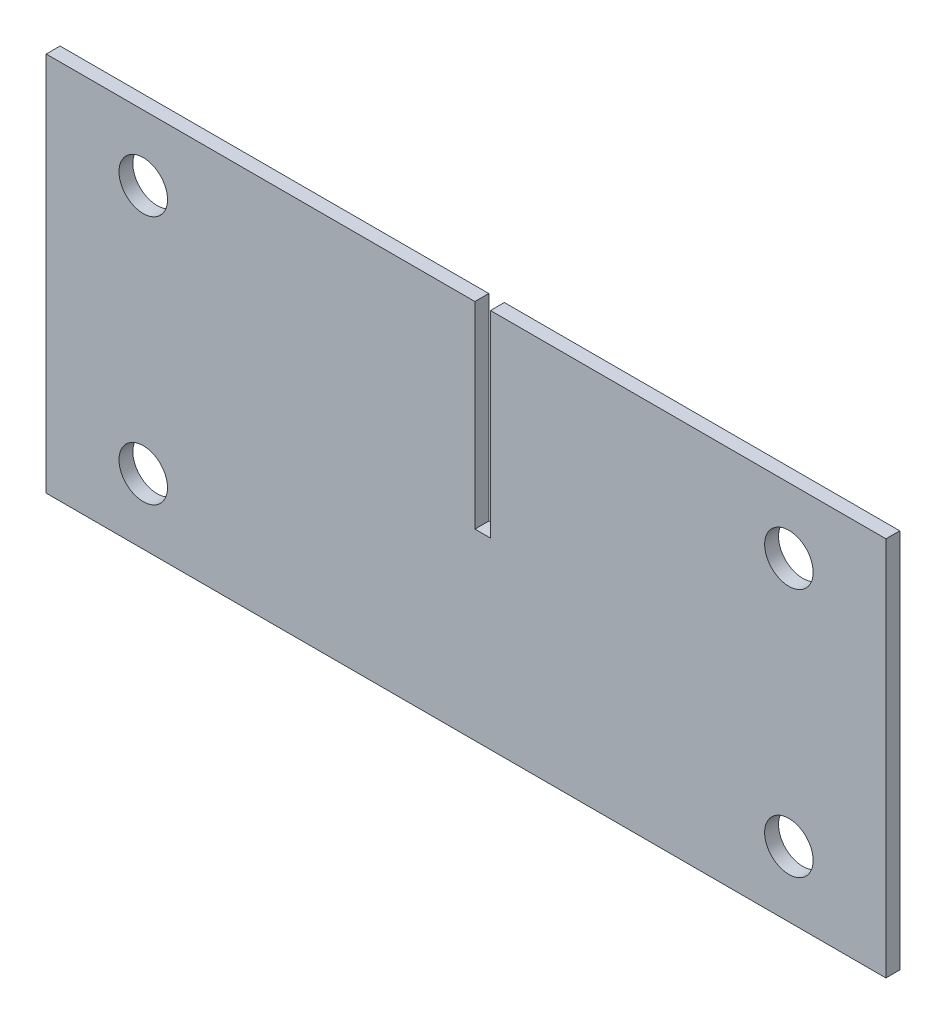
ISO-10303-21;
HEADER;
FILE_DESCRIPTION(('STEP AP214'),'2;1');
FILE_NAME('part.step','',(''),(''),'','','');
FILE_SCHEMA(('AUTOMOTIVE_DESIGN { 1 0 10303 214 1 1 1 1 }'));
ENDSEC;
DATA;
#1=APPLICATION_CONTEXT('core data for automotive mechanical design processes');
#2=APPLICATION_PROTOCOL_DEFINITION('international standard','automotive_design',2000,#1);
#3=PRODUCT_CONTEXT('',#1,'mechanical');
#4=PRODUCT('Part','Part','',(#3));
#5=PRODUCT_RELATED_PRODUCT_CATEGORY('part','',(#4));
#6=PRODUCT_DEFINITION_FORMATION('','',#4);
#7=PRODUCT_DEFINITION_CONTEXT('part definition',#1,'design');
#8=PRODUCT_DEFINITION('design','',#6,#7);
#9=PRODUCT_DEFINITION_SHAPE('','',#8);
#10=(LENGTH_UNIT() NAMED_UNIT(*) SI_UNIT(.MILLI.,.METRE.));
#11=(NAMED_UNIT(*) PLANE_ANGLE_UNIT() SI_UNIT($,.RADIAN.));
#12=(NAMED_UNIT(*) SI_UNIT($,.STERADIAN.) SOLID_ANGLE_UNIT());
#13=UNCERTAINTY_MEASURE_WITH_UNIT(LENGTH_MEASURE(1.E-05),#10,'distance_accuracy_value','');
#14=(GEOMETRIC_REPRESENTATION_CONTEXT(3) GLOBAL_UNCERTAINTY_ASSIGNED_CONTEXT((#13)) GLOBAL_UNIT_ASSIGNED_CONTEXT((#10,
#11,#12)) REPRESENTATION_CONTEXT('',''));
#15=CARTESIAN_POINT('',(0.,0.,0.));
#16=DIRECTION('',(0.,0.,1.));
#17=DIRECTION('',(1.,0.,0.));
#18=AXIS2_PLACEMENT_3D('',#15,#16,#17);
#19=CARTESIAN_POINT('',(1438.40975301925,226.21560485241,6.35));
#20=DIRECTION('',(0.,-1.,0.));
#21=DIRECTION('',(0.,0.,-1.));
#22=AXIS2_PLACEMENT_3D('',#19,#20,#21);
#23=PLANE('',#22);
#24=DIRECTION('',(-1.,0.,0.));
#25=VECTOR('',#24,1.);
#26=CARTESIAN_POINT('',(1438.40975301925,226.21560485241,0.));
#27=LINE('',#26,#25);
#28=CARTESIAN_POINT('',(1823.09275301925,226.21560485241,0.));
#29=VERTEX_POINT('',#28);
#30=CARTESIAN_POINT('',(1641.94312801925,226.21560485241,0.));
#31=VERTEX_POINT('',#30);
#32=EDGE_CURVE('E130',#29,#31,#27,.T.);
#33=ORIENTED_EDGE('',*,*,#32,.T.);
#34=DIRECTION('',(0.,0.,1.));
#35=VECTOR('',#34,1.);
#36=CARTESIAN_POINT('',(1641.94312801925,226.21560485241,-0.00100000000000013));
#37=LINE('',#36,#35);
#38=CARTESIAN_POINT('',(1641.94312801925,226.21560485241,6.35));
#39=VERTEX_POINT('',#38);
#40=EDGE_CURVE('E113',#31,#39,#37,.T.);
#41=ORIENTED_EDGE('',*,*,#40,.T.);
#42=DIRECTION('',(-1.,0.,0.));
#43=VECTOR('',#42,1.);
#44=CARTESIAN_POINT('',(1438.40975301925,226.21560485241,6.35));
#45=LINE('',#44,#43);
#46=CARTESIAN_POINT('',(1823.09275301925,226.21560485241,6.35));
#47=VERTEX_POINT('',#46);
#48=EDGE_CURVE('E145',#47,#39,#45,.T.);
#49=ORIENTED_EDGE('',*,*,#48,.F.);
#50=DIRECTION('',(0.,0.,-1.));
#51=VECTOR('',#50,1.);
#52=CARTESIAN_POINT('',(1823.09275301925,226.21560485241,6.35));
#53=LINE('',#52,#51);
#54=EDGE_CURVE('E135',#47,#29,#53,.T.);
#55=ORIENTED_EDGE('',*,*,#54,.T.);
#56=EDGE_LOOP('',(#33,#41,#49,#55));
#57=FACE_BOUND('',#56,.T.);
#58=ADVANCED_FACE('F38',(#57),#23,.F.);
#59=CARTESIAN_POINT('',(1438.40975301925,226.21560485241,6.35));
#60=DIRECTION('',(1.,0.,0.));
#61=DIRECTION('',(0.,0.,-1.));
#62=AXIS2_PLACEMENT_3D('',#59,#60,#61);
#63=PLANE('',#62);
#64=DIRECTION('',(0.,-1.,0.));
#65=VECTOR('',#64,1.);
#66=CARTESIAN_POINT('',(1438.40975301925,226.21560485241,0.));
#67=LINE('',#66,#65);
#68=CARTESIAN_POINT('',(1438.40975301925,226.21560485241,0.));
#69=VERTEX_POINT('',#68);
#70=CARTESIAN_POINT('',(1438.40975301925,51.9716048524095,0.));
#71=VERTEX_POINT('',#70);
#72=EDGE_CURVE('E153',#69,#71,#67,.T.);
#73=ORIENTED_EDGE('',*,*,#72,.T.);
#74=DIRECTION('',(0.,0.,-1.));
#75=VECTOR('',#74,1.);
#76=CARTESIAN_POINT('',(1438.40975301925,51.9716048524095,6.35));
#77=LINE('',#76,#75);
#78=CARTESIAN_POINT('',(1438.40975301925,51.9716048524095,6.35));
#79=VERTEX_POINT('',#78);
#80=EDGE_CURVE('E11',#79,#71,#77,.T.);
#81=ORIENTED_EDGE('',*,*,#80,.F.);
#82=DIRECTION('',(0.,-1.,0.));
#83=VECTOR('',#82,1.);
#84=CARTESIAN_POINT('',(1438.40975301925,226.21560485241,6.35));
#85=LINE('',#84,#83);
#86=CARTESIAN_POINT('',(1438.40975301925,226.21560485241,6.35));
#87=VERTEX_POINT('',#86);
#88=EDGE_CURVE('E136',#87,#79,#85,.T.);
#89=ORIENTED_EDGE('',*,*,#88,.F.);
#90=DIRECTION('',(0.,0.,-1.));
#91=VECTOR('',#90,1.);
#92=CARTESIAN_POINT('',(1438.40975301925,226.21560485241,6.35));
#93=LINE('',#92,#91);
#94=EDGE_CURVE('E143',#87,#69,#93,.T.);
#95=ORIENTED_EDGE('',*,*,#94,.T.);
#96=EDGE_LOOP('',(#73,#81,#89,#95));
#97=FACE_BOUND('',#96,.T.);
#98=ADVANCED_FACE('F40',(#97),#63,.F.);
#99=CARTESIAN_POINT('',(1438.40975301925,51.9716048524095,6.35));
#100=DIRECTION('',(0.,1.,0.));
#101=DIRECTION('',(0.,0.,1.));
#102=AXIS2_PLACEMENT_3D('',#99,#100,#101);
#103=PLANE('',#102);
#104=DIRECTION('',(1.,0.,0.));
#105=VECTOR('',#104,1.);
#106=CARTESIAN_POINT('',(1438.40975301925,51.9716048524095,0.));
#107=LINE('',#106,#105);
#108=CARTESIAN_POINT('',(1823.09275301925,51.9716048524095,0.));
#109=VERTEX_POINT('',#108);
#110=EDGE_CURVE('E152',#71,#109,#107,.T.);
#111=ORIENTED_EDGE('',*,*,#110,.T.);
#112=DIRECTION('',(0.,0.,-1.));
#113=VECTOR('',#112,1.);
#114=CARTESIAN_POINT('',(1823.09275301925,51.9716048524095,6.35));
#115=LINE('',#114,#113);
#116=CARTESIAN_POINT('',(1823.09275301925,51.9716048524095,6.35));
#117=VERTEX_POINT('',#116);
#118=EDGE_CURVE('E46',#117,#109,#115,.T.);
#119=ORIENTED_EDGE('',*,*,#118,.F.);
#120=DIRECTION('',(1.,0.,0.));
#121=VECTOR('',#120,1.);
#122=CARTESIAN_POINT('',(1438.40975301925,51.9716048524095,6.35));
#123=LINE('',#122,#121);
#124=EDGE_CURVE('E91',#79,#117,#123,.T.);
#125=ORIENTED_EDGE('',*,*,#124,.F.);
#126=ORIENTED_EDGE('',*,*,#80,.T.);
#127=EDGE_LOOP('',(#111,#119,#125,#126));
#128=FACE_BOUND('',#127,.T.);
#129=ADVANCED_FACE('F221',(#128),#103,.F.);
#130=CARTESIAN_POINT('',(1823.09275301925,226.21560485241,6.35));
#131=DIRECTION('',(-1.,0.,0.));
#132=DIRECTION('',(0.,0.,1.));
#133=AXIS2_PLACEMENT_3D('',#130,#131,#132);
#134=PLANE('',#133);
#135=DIRECTION('',(0.,1.,0.));
#136=VECTOR('',#135,1.);
#137=CARTESIAN_POINT('',(1823.09275301925,226.21560485241,0.));
#138=LINE('',#137,#136);
#139=EDGE_CURVE('E139',#109,#29,#138,.T.);
#140=ORIENTED_EDGE('',*,*,#139,.T.);
#141=ORIENTED_EDGE('',*,*,#54,.F.);
#142=DIRECTION('',(0.,1.,0.));
#143=VECTOR('',#142,1.);
#144=CARTESIAN_POINT('',(1823.09275301925,226.21560485241,6.35));
#145=LINE('',#144,#143);
#146=EDGE_CURVE('E150',#117,#47,#145,.T.);
#147=ORIENTED_EDGE('',*,*,#146,.F.);
#148=ORIENTED_EDGE('',*,*,#118,.T.);
#149=EDGE_LOOP('',(#140,#141,#147,#148));
#150=FACE_BOUND('',#149,.T.);
#151=ADVANCED_FACE('F149',(#150),#134,.F.);
#152=CARTESIAN_POINT('',(1634.79937801925,226.21560485241,6.35));
#153=VERTEX_POINT('',#152);
#154=EDGE_CURVE('E62',#153,#87,#45,.T.);
#155=ORIENTED_EDGE('',*,*,#154,.F.);
#156=DIRECTION('',(0.,0.,1.));
#157=VECTOR('',#156,1.);
#158=CARTESIAN_POINT('',(1634.79937801925,226.21560485241,-0.00100000000000013));
#159=LINE('',#158,#157);
#160=CARTESIAN_POINT('',(1634.79937801925,226.21560485241,0.));
#161=VERTEX_POINT('',#160);
#162=EDGE_CURVE('E123',#161,#153,#159,.T.);
#163=ORIENTED_EDGE('',*,*,#162,.F.);
#164=EDGE_CURVE('E84',#161,#69,#27,.T.);
#165=ORIENTED_EDGE('',*,*,#164,.T.);
#166=ORIENTED_EDGE('',*,*,#94,.F.);
#167=EDGE_LOOP('',(#155,#163,#165,#166));
#168=FACE_BOUND('',#167,.T.);
#169=ADVANCED_FACE('F199',(#168),#23,.F.);
#170=CARTESIAN_POINT('',(1438.40975301925,51.9716048524095,6.35));
#171=DIRECTION('',(0.,0.,1.));
#172=DIRECTION('',(1.,0.,0.));
#173=AXIS2_PLACEMENT_3D('',#170,#171,#172);
#174=PLANE('',#173);
#175=DIRECTION('',(0.,1.,0.));
#176=VECTOR('',#175,1.);
#177=CARTESIAN_POINT('',(1641.94312801925,226.21560485241,6.35));
#178=LINE('',#177,#176);
#179=CARTESIAN_POINT('',(1641.94312801925,135.91860485241,6.35));
#180=VERTEX_POINT('',#179);
#181=EDGE_CURVE('E118',#180,#39,#178,.T.);
#182=ORIENTED_EDGE('',*,*,#181,.F.);
#183=DIRECTION('',(1.,0.,0.));
#184=VECTOR('',#183,1.);
#185=CARTESIAN_POINT('',(1641.94312801925,135.91860485241,6.35));
#186=LINE('',#185,#184);
#187=CARTESIAN_POINT('',(1634.79937801925,135.91860485241,6.35));
#188=VERTEX_POINT('',#187);
#189=EDGE_CURVE('E124',#188,#180,#186,.T.);
#190=ORIENTED_EDGE('',*,*,#189,.F.);
#191=DIRECTION('',(0.,-1.,0.));
#192=VECTOR('',#191,1.);
#193=CARTESIAN_POINT('',(1634.79937801925,226.21560485241,6.35));
#194=LINE('',#193,#192);
#195=EDGE_CURVE('E191',#153,#188,#194,.T.);
#196=ORIENTED_EDGE('',*,*,#195,.F.);
#197=ORIENTED_EDGE('',*,*,#154,.T.);
#198=ORIENTED_EDGE('',*,*,#88,.T.);
#199=ORIENTED_EDGE('',*,*,#124,.T.);
#200=ORIENTED_EDGE('',*,*,#146,.T.);
#201=ORIENTED_EDGE('',*,*,#48,.T.);
#202=EDGE_LOOP('',(#182,#190,#196,#197,#198,#199,#200,#201));
#203=FACE_BOUND('',#202,.T.);
#204=CARTESIAN_POINT('',(1482.85975301925,81.9436048524095,6.35));
#205=DIRECTION('',(0.,0.,1.));
#206=DIRECTION('',(1.,0.,0.));
#207=AXIS2_PLACEMENT_3D('',#204,#205,#206);
#208=CIRCLE('',#207,11.1125000000001);
#209=CARTESIAN_POINT('',(1493.97225301925,81.9436048524095,6.35));
#210=VERTEX_POINT('',#209);
#211=EDGE_CURVE('E181',#210,#210,#208,.T.);
#212=ORIENTED_EDGE('',*,*,#211,.F.);
#213=EDGE_LOOP('',(#212));
#214=FACE_BOUND('',#213,.T.);
#215=CARTESIAN_POINT('',(1482.85975301925,196.24360485241,6.35));
#216=DIRECTION('',(0.,0.,1.));
#217=DIRECTION('',(1.,0.,0.));
#218=AXIS2_PLACEMENT_3D('',#215,#216,#217);
#219=CIRCLE('',#218,11.1125000000001);
#220=CARTESIAN_POINT('',(1493.97225301925,196.24360485241,6.35));
#221=VERTEX_POINT('',#220);
#222=EDGE_CURVE('E175',#221,#221,#219,.T.);
#223=ORIENTED_EDGE('',*,*,#222,.F.);
#224=EDGE_LOOP('',(#223));
#225=FACE_BOUND('',#224,.T.);
#226=CARTESIAN_POINT('',(1778.64275301925,81.9436048524096,6.35));
#227=DIRECTION('',(0.,0.,1.));
#228=DIRECTION('',(1.,0.,0.));
#229=AXIS2_PLACEMENT_3D('',#226,#227,#228);
#230=CIRCLE('',#229,11.1125000000001);
#231=CARTESIAN_POINT('',(1789.75525301925,81.9436048524096,6.35));
#232=VERTEX_POINT('',#231);
#233=EDGE_CURVE('E169',#232,#232,#230,.T.);
#234=ORIENTED_EDGE('',*,*,#233,.F.);
#235=EDGE_LOOP('',(#234));
#236=FACE_BOUND('',#235,.T.);
#237=CARTESIAN_POINT('',(1778.64275301925,196.24360485241,6.35));
#238=DIRECTION('',(0.,0.,1.));
#239=DIRECTION('',(1.,0.,0.));
#240=AXIS2_PLACEMENT_3D('',#237,#238,#239);
#241=CIRCLE('',#240,11.1125000000001);
#242=CARTESIAN_POINT('',(1789.75525301925,196.24360485241,6.35));
#243=VERTEX_POINT('',#242);
#244=EDGE_CURVE('E163',#243,#243,#241,.T.);
#245=ORIENTED_EDGE('',*,*,#244,.F.);
#246=EDGE_LOOP('',(#245));
#247=FACE_BOUND('',#246,.T.);
#248=ADVANCED_FACE('F203',(#203,#214,#225,#236,#247),#174,.T.);
#249=CARTESIAN_POINT('',(1438.40975301925,51.9716048524095,0.));
#250=DIRECTION('',(0.,0.,1.));
#251=DIRECTION('',(1.,0.,0.));
#252=AXIS2_PLACEMENT_3D('',#249,#250,#251);
#253=PLANE('',#252);
#254=CARTESIAN_POINT('',(1482.85975301925,81.9436048524095,0.));
#255=DIRECTION('',(0.,0.,1.));
#256=DIRECTION('',(1.,0.,0.));
#257=AXIS2_PLACEMENT_3D('',#254,#255,#256);
#258=CIRCLE('',#257,11.1125000000001);
#259=CARTESIAN_POINT('',(1493.97225301925,81.9436048524095,0.));
#260=VERTEX_POINT('',#259);
#261=EDGE_CURVE('E178',#260,#260,#258,.F.);
#262=ORIENTED_EDGE('',*,*,#261,.F.);
#263=EDGE_LOOP('',(#262));
#264=FACE_BOUND('',#263,.T.);
#265=CARTESIAN_POINT('',(1482.85975301925,196.24360485241,0.));
#266=DIRECTION('',(0.,0.,1.));
#267=DIRECTION('',(1.,0.,0.));
#268=AXIS2_PLACEMENT_3D('',#265,#266,#267);
#269=CIRCLE('',#268,11.1125000000001);
#270=CARTESIAN_POINT('',(1493.97225301925,196.24360485241,0.));
#271=VERTEX_POINT('',#270);
#272=EDGE_CURVE('E172',#271,#271,#269,.F.);
#273=ORIENTED_EDGE('',*,*,#272,.F.);
#274=EDGE_LOOP('',(#273));
#275=FACE_BOUND('',#274,.T.);
#276=CARTESIAN_POINT('',(1778.64275301925,81.9436048524096,0.));
#277=DIRECTION('',(0.,0.,1.));
#278=DIRECTION('',(1.,0.,0.));
#279=AXIS2_PLACEMENT_3D('',#276,#277,#278);
#280=CIRCLE('',#279,11.1125000000001);
#281=CARTESIAN_POINT('',(1789.75525301925,81.9436048524096,0.));
#282=VERTEX_POINT('',#281);
#283=EDGE_CURVE('E166',#282,#282,#280,.F.);
#284=ORIENTED_EDGE('',*,*,#283,.F.);
#285=EDGE_LOOP('',(#284));
#286=FACE_BOUND('',#285,.T.);
#287=CARTESIAN_POINT('',(1778.64275301925,196.24360485241,0.));
#288=DIRECTION('',(0.,0.,1.));
#289=DIRECTION('',(1.,0.,0.));
#290=AXIS2_PLACEMENT_3D('',#287,#288,#289);
#291=CIRCLE('',#290,11.1125000000001);
#292=CARTESIAN_POINT('',(1789.75525301925,196.24360485241,0.));
#293=VERTEX_POINT('',#292);
#294=EDGE_CURVE('E155',#293,#293,#291,.F.);
#295=ORIENTED_EDGE('',*,*,#294,.F.);
#296=EDGE_LOOP('',(#295));
#297=FACE_BOUND('',#296,.T.);
#298=DIRECTION('',(-1.,0.,0.));
#299=VECTOR('',#298,1.);
#300=CARTESIAN_POINT('',(1641.94312801925,135.91860485241,0.));
#301=LINE('',#300,#299);
#302=CARTESIAN_POINT('',(1641.94312801925,135.91860485241,0.));
#303=VERTEX_POINT('',#302);
#304=CARTESIAN_POINT('',(1634.79937801925,135.91860485241,0.));
#305=VERTEX_POINT('',#304);
#306=EDGE_CURVE('E53',#303,#305,#301,.T.);
#307=ORIENTED_EDGE('',*,*,#306,.F.);
#308=DIRECTION('',(0.,-1.,0.));
#309=VECTOR('',#308,1.);
#310=CARTESIAN_POINT('',(1641.94312801925,226.21560485241,0.));
#311=LINE('',#310,#309);
#312=EDGE_CURVE('E116',#31,#303,#311,.T.);
#313=ORIENTED_EDGE('',*,*,#312,.F.);
#314=ORIENTED_EDGE('',*,*,#32,.F.);
#315=ORIENTED_EDGE('',*,*,#139,.F.);
#316=ORIENTED_EDGE('',*,*,#110,.F.);
#317=ORIENTED_EDGE('',*,*,#72,.F.);
#318=ORIENTED_EDGE('',*,*,#164,.F.);
#319=DIRECTION('',(0.,1.,0.));
#320=VECTOR('',#319,1.);
#321=CARTESIAN_POINT('',(1634.79937801925,226.21560485241,0.));
#322=LINE('',#321,#320);
#323=EDGE_CURVE('E196',#305,#161,#322,.T.);
#324=ORIENTED_EDGE('',*,*,#323,.F.);
#325=EDGE_LOOP('',(#307,#313,#314,#315,#316,#317,#318,#324));
#326=FACE_BOUND('',#325,.T.);
#327=ADVANCED_FACE('F128',(#264,#275,#286,#297,#326),#253,.F.);
#328=CARTESIAN_POINT('',(1778.64275301925,196.24360485241,-0.00100000000000013));
#329=DIRECTION('',(0.,0.,1.));
#330=DIRECTION('',(1.,0.,0.));
#331=AXIS2_PLACEMENT_3D('',#328,#329,#330);
#332=CYLINDRICAL_SURFACE('',#331,11.1125000000001);
#333=ORIENTED_EDGE('',*,*,#244,.T.);
#334=EDGE_LOOP('',(#333));
#335=FACE_BOUND('',#334,.T.);
#336=ORIENTED_EDGE('',*,*,#294,.T.);
#337=EDGE_LOOP('',(#336));
#338=FACE_BOUND('',#337,.T.);
#339=ADVANCED_FACE('F265',(#335,#338),#332,.F.);
#340=CARTESIAN_POINT('',(1778.64275301925,81.9436048524096,-0.00100000000000013));
#341=DIRECTION('',(0.,0.,1.));
#342=DIRECTION('',(1.,0.,0.));
#343=AXIS2_PLACEMENT_3D('',#340,#341,#342);
#344=CYLINDRICAL_SURFACE('',#343,11.1125000000001);
#345=ORIENTED_EDGE('',*,*,#233,.T.);
#346=EDGE_LOOP('',(#345));
#347=FACE_BOUND('',#346,.T.);
#348=ORIENTED_EDGE('',*,*,#283,.T.);
#349=EDGE_LOOP('',(#348));
#350=FACE_BOUND('',#349,.T.);
#351=ADVANCED_FACE('F273',(#347,#350),#344,.F.);
#352=CARTESIAN_POINT('',(1482.85975301925,196.24360485241,-0.00100000000000013));
#353=DIRECTION('',(0.,0.,1.));
#354=DIRECTION('',(1.,0.,0.));
#355=AXIS2_PLACEMENT_3D('',#352,#353,#354);
#356=CYLINDRICAL_SURFACE('',#355,11.1125000000001);
#357=ORIENTED_EDGE('',*,*,#222,.T.);
#358=EDGE_LOOP('',(#357));
#359=FACE_BOUND('',#358,.T.);
#360=ORIENTED_EDGE('',*,*,#272,.T.);
#361=EDGE_LOOP('',(#360));
#362=FACE_BOUND('',#361,.T.);
#363=ADVANCED_FACE('F282',(#359,#362),#356,.F.);
#364=CARTESIAN_POINT('',(1482.85975301925,81.9436048524095,-0.00100000000000013));
#365=DIRECTION('',(0.,0.,1.));
#366=DIRECTION('',(1.,0.,0.));
#367=AXIS2_PLACEMENT_3D('',#364,#365,#366);
#368=CYLINDRICAL_SURFACE('',#367,11.1125000000001);
#369=ORIENTED_EDGE('',*,*,#211,.T.);
#370=EDGE_LOOP('',(#369));
#371=FACE_BOUND('',#370,.T.);
#372=ORIENTED_EDGE('',*,*,#261,.T.);
#373=EDGE_LOOP('',(#372));
#374=FACE_BOUND('',#373,.T.);
#375=ADVANCED_FACE('F214',(#371,#374),#368,.F.);
#376=CARTESIAN_POINT('',(1641.94312801925,226.21560485241,-0.00100000000000013));
#377=DIRECTION('',(1.,0.,0.));
#378=DIRECTION('',(0.,0.,-1.));
#379=AXIS2_PLACEMENT_3D('',#376,#377,#378);
#380=PLANE('',#379);
#381=ORIENTED_EDGE('',*,*,#312,.T.);
#382=DIRECTION('',(0.,0.,1.));
#383=VECTOR('',#382,1.);
#384=CARTESIAN_POINT('',(1641.94312801925,135.91860485241,-0.00100000000000013));
#385=LINE('',#384,#383);
#386=EDGE_CURVE('E183',#303,#180,#385,.T.);
#387=ORIENTED_EDGE('',*,*,#386,.T.);
#388=ORIENTED_EDGE('',*,*,#181,.T.);
#389=ORIENTED_EDGE('',*,*,#40,.F.);
#390=EDGE_LOOP('',(#381,#387,#388,#389));
#391=FACE_BOUND('',#390,.T.);
#392=ADVANCED_FACE('F115',(#391),#380,.F.);
#393=CARTESIAN_POINT('',(1641.94312801925,135.91860485241,-0.00100000000000013));
#394=DIRECTION('',(0.,-1.,0.));
#395=DIRECTION('',(0.,0.,-1.));
#396=AXIS2_PLACEMENT_3D('',#393,#394,#395);
#397=PLANE('',#396);
#398=ORIENTED_EDGE('',*,*,#306,.T.);
#399=DIRECTION('',(0.,0.,1.));
#400=VECTOR('',#399,1.);
#401=CARTESIAN_POINT('',(1634.79937801925,135.91860485241,-0.00100000000000013));
#402=LINE('',#401,#400);
#403=EDGE_CURVE('E186',#305,#188,#402,.T.);
#404=ORIENTED_EDGE('',*,*,#403,.T.);
#405=ORIENTED_EDGE('',*,*,#189,.T.);
#406=ORIENTED_EDGE('',*,*,#386,.F.);
#407=EDGE_LOOP('',(#398,#404,#405,#406));
#408=FACE_BOUND('',#407,.T.);
#409=ADVANCED_FACE('F206',(#408),#397,.F.);
#410=CARTESIAN_POINT('',(1634.79937801925,226.21560485241,-0.00100000000000013));
#411=DIRECTION('',(-1.,0.,0.));
#412=DIRECTION('',(0.,0.,1.));
#413=AXIS2_PLACEMENT_3D('',#410,#411,#412);
#414=PLANE('',#413);
#415=ORIENTED_EDGE('',*,*,#323,.T.);
#416=ORIENTED_EDGE('',*,*,#162,.T.);
#417=ORIENTED_EDGE('',*,*,#195,.T.);
#418=ORIENTED_EDGE('',*,*,#403,.F.);
#419=EDGE_LOOP('',(#415,#416,#417,#418));
#420=FACE_BOUND('',#419,.T.);
#421=ADVANCED_FACE('F198',(#420),#414,.F.);
#422=CLOSED_SHELL('',(#58,#98,#129,#151,#169,#248,#327,#339,#351,#363,#375,#392,#409,#421));
#423=MANIFOLD_SOLID_BREP('B2',#422);
#424=ADVANCED_BREP_SHAPE_REPRESENTATION('',(#18,#423),#14);
#425=SHAPE_DEFINITION_REPRESENTATION(#9,#424);
ENDSEC;
END-ISO-10303-21;
